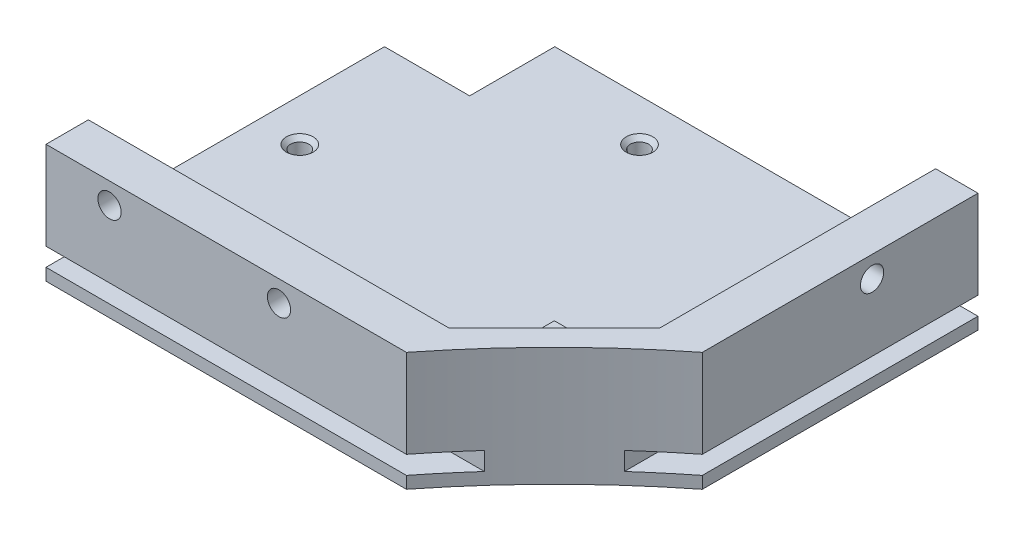
ISO-10303-21;
HEADER;
FILE_DESCRIPTION(('STEP AP214'),'2;1');
FILE_NAME('part.step','',(''),(''),'','','');
FILE_SCHEMA(('AUTOMOTIVE_DESIGN { 1 0 10303 214 1 1 1 1 }'));
ENDSEC;
DATA;
#1=APPLICATION_CONTEXT('core data for automotive mechanical design processes');
#2=APPLICATION_PROTOCOL_DEFINITION('international standard','automotive_design',2000,#1);
#3=PRODUCT_CONTEXT('',#1,'mechanical');
#4=PRODUCT('Part','Part','',(#3));
#5=PRODUCT_RELATED_PRODUCT_CATEGORY('part','',(#4));
#6=PRODUCT_DEFINITION_FORMATION('','',#4);
#7=PRODUCT_DEFINITION_CONTEXT('part definition',#1,'design');
#8=PRODUCT_DEFINITION('design','',#6,#7);
#9=PRODUCT_DEFINITION_SHAPE('','',#8);
#10=(LENGTH_UNIT() NAMED_UNIT(*) SI_UNIT(.MILLI.,.METRE.));
#11=(NAMED_UNIT(*) PLANE_ANGLE_UNIT() SI_UNIT($,.RADIAN.));
#12=(NAMED_UNIT(*) SI_UNIT($,.STERADIAN.) SOLID_ANGLE_UNIT());
#13=UNCERTAINTY_MEASURE_WITH_UNIT(LENGTH_MEASURE(1.E-05),#10,'distance_accuracy_value','');
#14=(GEOMETRIC_REPRESENTATION_CONTEXT(3) GLOBAL_UNCERTAINTY_ASSIGNED_CONTEXT((#13)) GLOBAL_UNIT_ASSIGNED_CONTEXT((#10,
#11,#12)) REPRESENTATION_CONTEXT('',''));
#15=CARTESIAN_POINT('',(0.,0.,0.));
#16=DIRECTION('',(0.,0.,1.));
#17=DIRECTION('',(1.,0.,0.));
#18=AXIS2_PLACEMENT_3D('',#15,#16,#17);
#19=CARTESIAN_POINT('',(160.08,28.,-429.92));
#20=DIRECTION('',(1.,0.,0.));
#21=DIRECTION('',(0.,0.,-1.));
#22=AXIS2_PLACEMENT_3D('',#19,#20,#21);
#23=PLANE('',#22);
#24=DIRECTION('',(0.,0.,1.));
#25=VECTOR('',#24,1.);
#26=CARTESIAN_POINT('',(160.08,17.,-489.92));
#27=LINE('',#26,#25);
#28=CARTESIAN_POINT('',(160.08,17.,-489.92));
#29=VERTEX_POINT('',#28);
#30=CARTESIAN_POINT('',(160.08,17.,-465.));
#31=VERTEX_POINT('',#30);
#32=EDGE_CURVE('E288',#29,#31,#27,.T.);
#33=ORIENTED_EDGE('',*,*,#32,.F.);
#34=DIRECTION('',(0.,-1.,0.));
#35=VECTOR('',#34,1.);
#36=CARTESIAN_POINT('',(160.08,28.,-489.92));
#37=LINE('',#36,#35);
#38=CARTESIAN_POINT('',(160.08,8.,-489.92));
#39=VERTEX_POINT('',#38);
#40=EDGE_CURVE('E298',#29,#39,#37,.T.);
#41=ORIENTED_EDGE('',*,*,#40,.T.);
#42=DIRECTION('',(0.,0.,-1.));
#43=VECTOR('',#42,1.);
#44=CARTESIAN_POINT('',(160.08,8.,-429.92));
#45=LINE('',#44,#43);
#46=CARTESIAN_POINT('',(160.08,8.,-475.));
#47=VERTEX_POINT('',#46);
#48=EDGE_CURVE('E305',#47,#39,#45,.T.);
#49=ORIENTED_EDGE('',*,*,#48,.F.);
#50=DIRECTION('',(0.,-0.668964731622449,-0.743294146247167));
#51=VECTOR('',#50,1.);
#52=CARTESIAN_POINT('',(160.08,17.,-465.));
#53=LINE('',#52,#51);
#54=EDGE_CURVE('E345',#31,#47,#53,.T.);
#55=ORIENTED_EDGE('',*,*,#54,.F.);
#56=EDGE_LOOP('',(#33,#41,#49,#55));
#57=FACE_BOUND('',#56,.T.);
#58=ADVANCED_FACE('F48',(#57),#23,.F.);
#59=CARTESIAN_POINT('',(0.,0.,-489.92));
#60=DIRECTION('',(0.,0.,1.));
#61=DIRECTION('',(1.,0.,0.));
#62=AXIS2_PLACEMENT_3D('',#59,#60,#61);
#63=PLANE('',#62);
#64=DIRECTION('',(-1.,0.,0.));
#65=VECTOR('',#64,1.);
#66=CARTESIAN_POINT('',(185.,17.,-489.92));
#67=LINE('',#66,#65);
#68=CARTESIAN_POINT('',(185.,17.,-489.92));
#69=VERTEX_POINT('',#68);
#70=EDGE_CURVE('E285',#69,#29,#67,.T.);
#71=ORIENTED_EDGE('',*,*,#70,.F.);
#72=DIRECTION('',(0.743294146247166,0.66896473162245,0.));
#73=VECTOR('',#72,1.);
#74=CARTESIAN_POINT('',(185.,17.,-489.92));
#75=LINE('',#74,#73);
#76=CARTESIAN_POINT('',(175.,8.,-489.92));
#77=VERTEX_POINT('',#76);
#78=EDGE_CURVE('E353',#77,#69,#75,.T.);
#79=ORIENTED_EDGE('',*,*,#78,.F.);
#80=DIRECTION('',(1.,0.,0.));
#81=VECTOR('',#80,1.);
#82=CARTESIAN_POINT('',(160.08,8.,-489.92));
#83=LINE('',#82,#81);
#84=EDGE_CURVE('E301',#39,#77,#83,.T.);
#85=ORIENTED_EDGE('',*,*,#84,.F.);
#86=ORIENTED_EDGE('',*,*,#40,.F.);
#87=EDGE_LOOP('',(#71,#79,#85,#86));
#88=FACE_BOUND('',#87,.T.);
#89=ADVANCED_FACE('F542',(#88),#63,.F.);
#90=CARTESIAN_POINT('',(0.,8.,0.));
#91=DIRECTION('',(0.,-1.,0.));
#92=DIRECTION('',(0.,0.,-1.));
#93=AXIS2_PLACEMENT_3D('',#90,#91,#92);
#94=PLANE('',#93);
#95=CARTESIAN_POINT('',(125.1,8.,-545.));
#96=DIRECTION('',(0.,-1.,0.));
#97=DIRECTION('',(0.,0.,-1.));
#98=AXIS2_PLACEMENT_3D('',#95,#96,#97);
#99=CIRCLE('',#98,3.14999999999999);
#100=CARTESIAN_POINT('',(125.1,8.,-548.15));
#101=VERTEX_POINT('',#100);
#102=EDGE_CURVE('E58',#101,#101,#99,.T.);
#103=ORIENTED_EDGE('',*,*,#102,.T.);
#104=EDGE_LOOP('',(#103));
#105=FACE_BOUND('',#104,.T.);
#106=CARTESIAN_POINT('',(85.,8.,-504.9));
#107=DIRECTION('',(0.,-1.,0.));
#108=DIRECTION('',(0.,0.,-1.));
#109=AXIS2_PLACEMENT_3D('',#106,#107,#108);
#110=CIRCLE('',#109,3.14999999999999);
#111=CARTESIAN_POINT('',(85.,8.,-508.05));
#112=VERTEX_POINT('',#111);
#113=EDGE_CURVE('E443',#112,#112,#110,.T.);
#114=ORIENTED_EDGE('',*,*,#113,.T.);
#115=EDGE_LOOP('',(#114));
#116=FACE_BOUND('',#115,.T.);
#117=DIRECTION('',(-1.,0.,0.));
#118=VECTOR('',#117,1.);
#119=CARTESIAN_POINT('',(0.,8.,-555.));
#120=LINE('',#119,#118);
#121=CARTESIAN_POINT('',(175.,8.,-555.));
#122=VERTEX_POINT('',#121);
#123=CARTESIAN_POINT('',(95.1,8.,-555.));
#124=VERTEX_POINT('',#123);
#125=EDGE_CURVE('E254',#122,#124,#120,.T.);
#126=ORIENTED_EDGE('',*,*,#125,.T.);
#127=DIRECTION('',(0.,0.,-1.));
#128=VECTOR('',#127,1.);
#129=CARTESIAN_POINT('',(95.1,8.,-555.));
#130=LINE('',#129,#128);
#131=CARTESIAN_POINT('',(95.1,8.,-534.9));
#132=VERTEX_POINT('',#131);
#133=EDGE_CURVE('E216',#132,#124,#130,.T.);
#134=ORIENTED_EDGE('',*,*,#133,.F.);
#135=DIRECTION('',(1.,0.,0.));
#136=VECTOR('',#135,1.);
#137=CARTESIAN_POINT('',(95.1,8.,-534.9));
#138=LINE('',#137,#136);
#139=CARTESIAN_POINT('',(75.,8.,-534.9));
#140=VERTEX_POINT('',#139);
#141=EDGE_CURVE('E201',#140,#132,#138,.T.);
#142=ORIENTED_EDGE('',*,*,#141,.F.);
#143=DIRECTION('',(0.,0.,1.));
#144=VECTOR('',#143,1.);
#145=CARTESIAN_POINT('',(75.,8.,0.));
#146=LINE('',#145,#144);
#147=CARTESIAN_POINT('',(75.,8.00000000000002,-475.));
#148=VERTEX_POINT('',#147);
#149=EDGE_CURVE('E214',#140,#148,#146,.T.);
#150=ORIENTED_EDGE('',*,*,#149,.T.);
#151=DIRECTION('',(-1.,0.,0.));
#152=VECTOR('',#151,1.);
#153=CARTESIAN_POINT('',(160.08,8.,-475.));
#154=LINE('',#153,#152);
#155=EDGE_CURVE('E350',#47,#148,#154,.T.);
#156=ORIENTED_EDGE('',*,*,#155,.F.);
#157=ORIENTED_EDGE('',*,*,#48,.T.);
#158=ORIENTED_EDGE('',*,*,#84,.T.);
#159=DIRECTION('',(0.,0.,-1.));
#160=VECTOR('',#159,1.);
#161=CARTESIAN_POINT('',(175.,8.,-489.92));
#162=LINE('',#161,#160);
#163=EDGE_CURVE('E372',#77,#122,#162,.T.);
#164=ORIENTED_EDGE('',*,*,#163,.T.);
#165=EDGE_LOOP('',(#126,#134,#142,#150,#156,#157,#158,#164));
#166=FACE_BOUND('',#165,.T.);
#167=ADVANCED_FACE('F212',(#105,#116,#166),#94,.F.);
#168=CARTESIAN_POINT('',(195.,0.,-489.924225024707));
#169=DIRECTION('',(1.,0.,0.));
#170=DIRECTION('',(0.,0.,-1.));
#171=AXIS2_PLACEMENT_3D('',#168,#169,#170);
#172=PLANE('',#171);
#173=DIRECTION('',(0.,1.,0.));
#174=VECTOR('',#173,1.);
#175=CARTESIAN_POINT('',(195.,0.,-555.));
#176=LINE('',#175,#174);
#177=CARTESIAN_POINT('',(195.,7.15,-555.));
#178=VERTEX_POINT('',#177);
#179=CARTESIAN_POINT('',(195.,28.,-555.));
#180=VERTEX_POINT('',#179);
#181=EDGE_CURVE('E237',#178,#180,#176,.T.);
#182=ORIENTED_EDGE('',*,*,#181,.T.);
#183=DIRECTION('',(0.,0.,-1.));
#184=VECTOR('',#183,1.);
#185=CARTESIAN_POINT('',(195.,28.,-489.92));
#186=LINE('',#185,#184);
#187=CARTESIAN_POINT('',(195.,28.,-489.924225024706));
#188=VERTEX_POINT('',#187);
#189=EDGE_CURVE('E373',#188,#180,#186,.T.);
#190=ORIENTED_EDGE('',*,*,#189,.F.);
#191=DIRECTION('',(0.,1.,0.));
#192=VECTOR('',#191,1.);
#193=CARTESIAN_POINT('',(195.,0.,-489.924225024707));
#194=LINE('',#193,#192);
#195=CARTESIAN_POINT('',(195.,7.15,-489.924225024707));
#196=VERTEX_POINT('',#195);
#197=EDGE_CURVE('E405',#188,#196,#194,.F.);
#198=ORIENTED_EDGE('',*,*,#197,.T.);
#199=DIRECTION('',(0.,0.,1.));
#200=VECTOR('',#199,1.);
#201=CARTESIAN_POINT('',(195.,7.15,-489.924225024707));
#202=LINE('',#201,#200);
#203=EDGE_CURVE('E424',#178,#196,#202,.T.);
#204=ORIENTED_EDGE('',*,*,#203,.F.);
#205=EDGE_LOOP('',(#182,#190,#198,#204));
#206=FACE_BOUND('',#205,.T.);
#207=CARTESIAN_POINT('',(195.,23.,-530.));
#208=DIRECTION('',(1.,0.,0.));
#209=DIRECTION('',(0.,0.,-1.));
#210=AXIS2_PLACEMENT_3D('',#207,#208,#209);
#211=CIRCLE('',#210,2.75000000000004);
#212=CARTESIAN_POINT('',(195.,23.,-532.75));
#213=VERTEX_POINT('',#212);
#214=EDGE_CURVE('E277',#213,#213,#211,.T.);
#215=ORIENTED_EDGE('',*,*,#214,.F.);
#216=EDGE_LOOP('',(#215));
#217=FACE_BOUND('',#216,.T.);
#218=ADVANCED_FACE('F557',(#206,#217),#172,.T.);
#219=CARTESIAN_POINT('',(195.,0.,-455.));
#220=DIRECTION('',(0.,0.,1.));
#221=DIRECTION('',(1.,0.,0.));
#222=AXIS2_PLACEMENT_3D('',#219,#220,#221);
#223=PLANE('',#222);
#224=DIRECTION('',(0.,1.,0.));
#225=VECTOR('',#224,1.);
#226=CARTESIAN_POINT('',(75.,0.,-455.));
#227=LINE('',#226,#225);
#228=CARTESIAN_POINT('',(75.,0.,-455.));
#229=VERTEX_POINT('',#228);
#230=CARTESIAN_POINT('',(75.,2.85,-455.));
#231=VERTEX_POINT('',#230);
#232=EDGE_CURVE('E494',#229,#231,#227,.T.);
#233=ORIENTED_EDGE('',*,*,#232,.F.);
#234=DIRECTION('',(1.,0.,0.));
#235=VECTOR('',#234,1.);
#236=CARTESIAN_POINT('',(160.075774975293,0.,-455.));
#237=LINE('',#236,#235);
#238=CARTESIAN_POINT('',(160.075774975293,0.,-455.));
#239=VERTEX_POINT('',#238);
#240=EDGE_CURVE('E377',#229,#239,#237,.T.);
#241=ORIENTED_EDGE('',*,*,#240,.T.);
#242=DIRECTION('',(0.,1.,0.));
#243=VECTOR('',#242,1.);
#244=CARTESIAN_POINT('',(160.075774975293,0.,-455.));
#245=LINE('',#244,#243);
#246=CARTESIAN_POINT('',(160.075774975293,2.85,-455.));
#247=VERTEX_POINT('',#246);
#248=EDGE_CURVE('E400',#239,#247,#245,.T.);
#249=ORIENTED_EDGE('',*,*,#248,.T.);
#250=DIRECTION('',(1.,0.,0.));
#251=VECTOR('',#250,1.);
#252=CARTESIAN_POINT('',(195.,2.85,-455.));
#253=LINE('',#252,#251);
#254=EDGE_CURVE('E413',#231,#247,#253,.T.);
#255=ORIENTED_EDGE('',*,*,#254,.F.);
#256=EDGE_LOOP('',(#233,#241,#249,#255));
#257=FACE_BOUND('',#256,.T.);
#258=ADVANCED_FACE('F468',(#257),#223,.T.);
#259=CARTESIAN_POINT('',(0.,0.,0.));
#260=DIRECTION('',(0.,-1.,0.));
#261=DIRECTION('',(0.,0.,-1.));
#262=AXIS2_PLACEMENT_3D('',#259,#260,#261);
#263=PLANE('',#262);
#264=CARTESIAN_POINT('',(85.,0.,-504.9));
#265=DIRECTION('',(0.,-1.,0.));
#266=DIRECTION('',(0.,0.,-1.));
#267=AXIS2_PLACEMENT_3D('',#264,#265,#266);
#268=CIRCLE('',#267,2.15);
#269=CARTESIAN_POINT('',(85.,0.,-507.05));
#270=VERTEX_POINT('',#269);
#271=EDGE_CURVE('E218',#270,#270,#268,.T.);
#272=ORIENTED_EDGE('',*,*,#271,.F.);
#273=EDGE_LOOP('',(#272));
#274=FACE_BOUND('',#273,.T.);
#275=CARTESIAN_POINT('',(125.1,0.,-545.));
#276=DIRECTION('',(0.,-1.,0.));
#277=DIRECTION('',(0.,0.,-1.));
#278=AXIS2_PLACEMENT_3D('',#275,#276,#277);
#279=CIRCLE('',#278,2.15000000000002);
#280=CARTESIAN_POINT('',(125.1,0.,-547.15));
#281=VERTEX_POINT('',#280);
#282=EDGE_CURVE('E433',#281,#281,#279,.T.);
#283=ORIENTED_EDGE('',*,*,#282,.F.);
#284=EDGE_LOOP('',(#283));
#285=FACE_BOUND('',#284,.T.);
#286=DIRECTION('',(0.,0.,1.));
#287=VECTOR('',#286,1.);
#288=CARTESIAN_POINT('',(95.1,0.,0.));
#289=LINE('',#288,#287);
#290=CARTESIAN_POINT('',(95.1,0.,-555.));
#291=VERTEX_POINT('',#290);
#292=CARTESIAN_POINT('',(95.1,0.,-534.9));
#293=VERTEX_POINT('',#292);
#294=EDGE_CURVE('E472',#291,#293,#289,.T.);
#295=ORIENTED_EDGE('',*,*,#294,.F.);
#296=DIRECTION('',(1.,0.,0.));
#297=VECTOR('',#296,1.);
#298=CARTESIAN_POINT('',(195.,0.,-555.));
#299=LINE('',#298,#297);
#300=CARTESIAN_POINT('',(195.,0.,-555.));
#301=VERTEX_POINT('',#300);
#302=EDGE_CURVE('E229',#291,#301,#299,.T.);
#303=ORIENTED_EDGE('',*,*,#302,.T.);
#304=DIRECTION('',(0.,0.,-1.));
#305=VECTOR('',#304,1.);
#306=CARTESIAN_POINT('',(195.,0.,-455.));
#307=LINE('',#306,#305);
#308=CARTESIAN_POINT('',(195.,0.,-489.924225024707));
#309=VERTEX_POINT('',#308);
#310=EDGE_CURVE('E391',#309,#301,#307,.T.);
#311=ORIENTED_EDGE('',*,*,#310,.F.);
#312=CARTESIAN_POINT('',(325.,0.,-325.));
#313=DIRECTION('',(0.,1.,0.));
#314=DIRECTION('',(0.,0.,1.));
#315=AXIS2_PLACEMENT_3D('',#312,#313,#314);
#316=CIRCLE('',#315,210.);
#317=EDGE_CURVE('E395',#309,#239,#316,.T.);
#318=ORIENTED_EDGE('',*,*,#317,.T.);
#319=ORIENTED_EDGE('',*,*,#240,.F.);
#320=DIRECTION('',(0.,0.,-1.));
#321=VECTOR('',#320,1.);
#322=CARTESIAN_POINT('',(75.,0.,-455.));
#323=LINE('',#322,#321);
#324=CARTESIAN_POINT('',(75.,0.,-534.9));
#325=VERTEX_POINT('',#324);
#326=EDGE_CURVE('E495',#229,#325,#323,.T.);
#327=ORIENTED_EDGE('',*,*,#326,.T.);
#328=DIRECTION('',(-1.,0.,0.));
#329=VECTOR('',#328,1.);
#330=CARTESIAN_POINT('',(0.,0.,-534.9));
#331=LINE('',#330,#329);
#332=EDGE_CURVE('E65',#293,#325,#331,.T.);
#333=ORIENTED_EDGE('',*,*,#332,.F.);
#334=EDGE_LOOP('',(#295,#303,#311,#318,#319,#327,#333));
#335=FACE_BOUND('',#334,.T.);
#336=ADVANCED_FACE('F464',(#274,#285,#335),#263,.T.);
#337=CARTESIAN_POINT('',(325.,0.,-325.));
#338=DIRECTION('',(0.,1.,0.));
#339=DIRECTION('',(0.,0.,1.));
#340=AXIS2_PLACEMENT_3D('',#337,#338,#339);
#341=CYLINDRICAL_SURFACE('',#340,210.);
#342=ORIENTED_EDGE('',*,*,#197,.F.);
#343=CARTESIAN_POINT('',(325.,28.,-325.));
#344=DIRECTION('',(0.,1.,0.));
#345=DIRECTION('',(0.,0.,1.));
#346=AXIS2_PLACEMENT_3D('',#343,#344,#345);
#347=CIRCLE('',#346,210.);
#348=CARTESIAN_POINT('',(160.075774975294,28.,-455.));
#349=VERTEX_POINT('',#348);
#350=EDGE_CURVE('E292',#188,#349,#347,.T.);
#351=ORIENTED_EDGE('',*,*,#350,.T.);
#352=CARTESIAN_POINT('',(160.075774975293,7.15,-455.));
#353=VERTEX_POINT('',#352);
#354=EDGE_CURVE('E399',#353,#349,#245,.T.);
#355=ORIENTED_EDGE('',*,*,#354,.F.);
#356=CARTESIAN_POINT('',(325.,7.15000000000001,-325.));
#357=DIRECTION('',(0.,1.,0.));
#358=DIRECTION('',(0.,0.,1.));
#359=AXIS2_PLACEMENT_3D('',#356,#357,#358);
#360=CIRCLE('',#359,210.);
#361=CARTESIAN_POINT('',(168.475241575015,7.15,-465.));
#362=VERTEX_POINT('',#361);
#363=EDGE_CURVE('E330',#353,#362,#360,.F.);
#364=ORIENTED_EDGE('',*,*,#363,.T.);
#365=DIRECTION('',(0.,1.,0.));
#366=VECTOR('',#365,1.);
#367=CARTESIAN_POINT('',(168.475241575015,0.,-465.));
#368=LINE('',#367,#366);
#369=CARTESIAN_POINT('',(168.475241575015,2.85,-465.));
#370=VERTEX_POINT('',#369);
#371=EDGE_CURVE('E416',#362,#370,#368,.F.);
#372=ORIENTED_EDGE('',*,*,#371,.T.);
#373=CARTESIAN_POINT('',(325.,2.85,-325.));
#374=DIRECTION('',(0.,-1.,0.));
#375=DIRECTION('',(0.,0.,-1.));
#376=AXIS2_PLACEMENT_3D('',#373,#374,#375);
#377=CIRCLE('',#376,210.);
#378=EDGE_CURVE('E337',#370,#247,#377,.F.);
#379=ORIENTED_EDGE('',*,*,#378,.T.);
#380=ORIENTED_EDGE('',*,*,#248,.F.);
#381=ORIENTED_EDGE('',*,*,#317,.F.);
#382=CARTESIAN_POINT('',(195.,2.85,-489.924225024707));
#383=VERTEX_POINT('',#382);
#384=EDGE_CURVE('E404',#383,#309,#194,.F.);
#385=ORIENTED_EDGE('',*,*,#384,.F.);
#386=CARTESIAN_POINT('',(325.,2.84999999999998,-325.));
#387=DIRECTION('',(0.,-1.,0.));
#388=DIRECTION('',(1.,0.,0.));
#389=AXIS2_PLACEMENT_3D('',#386,#387,#388);
#390=CIRCLE('',#389,210.);
#391=CARTESIAN_POINT('',(185.,2.85,-481.524758424985));
#392=VERTEX_POINT('',#391);
#393=EDGE_CURVE('E314',#383,#392,#390,.F.);
#394=ORIENTED_EDGE('',*,*,#393,.T.);
#395=DIRECTION('',(0.,1.,0.));
#396=VECTOR('',#395,1.);
#397=CARTESIAN_POINT('',(185.,0.,-481.524758424985));
#398=LINE('',#397,#396);
#399=CARTESIAN_POINT('',(185.,7.15,-481.524758424985));
#400=VERTEX_POINT('',#399);
#401=EDGE_CURVE('E427',#392,#400,#398,.T.);
#402=ORIENTED_EDGE('',*,*,#401,.T.);
#403=CARTESIAN_POINT('',(325.,7.15,-325.));
#404=DIRECTION('',(0.,1.,0.));
#405=DIRECTION('',(0.,0.,1.));
#406=AXIS2_PLACEMENT_3D('',#403,#404,#405);
#407=CIRCLE('',#406,210.);
#408=EDGE_CURVE('E321',#400,#196,#407,.F.);
#409=ORIENTED_EDGE('',*,*,#408,.T.);
#410=EDGE_LOOP('',(#342,#351,#355,#364,#372,#379,#380,#381,#385,#394,#402,#409));
#411=FACE_BOUND('',#410,.T.);
#412=ADVANCED_FACE('F467',(#411),#341,.F.);
#413=CARTESIAN_POINT('',(75.,7.15,-455.));
#414=VERTEX_POINT('',#413);
#415=CARTESIAN_POINT('',(75.,28.,-455.));
#416=VERTEX_POINT('',#415);
#417=EDGE_CURVE('E497',#414,#416,#227,.T.);
#418=ORIENTED_EDGE('',*,*,#417,.F.);
#419=DIRECTION('',(-1.,0.,0.));
#420=VECTOR('',#419,1.);
#421=CARTESIAN_POINT('',(195.,7.15,-455.));
#422=LINE('',#421,#420);
#423=EDGE_CURVE('E409',#353,#414,#422,.T.);
#424=ORIENTED_EDGE('',*,*,#423,.F.);
#425=ORIENTED_EDGE('',*,*,#354,.T.);
#426=DIRECTION('',(-1.,0.,0.));
#427=VECTOR('',#426,1.);
#428=CARTESIAN_POINT('',(160.08,28.,-455.));
#429=LINE('',#428,#427);
#430=EDGE_CURVE('E349',#349,#416,#429,.T.);
#431=ORIENTED_EDGE('',*,*,#430,.T.);
#432=EDGE_LOOP('',(#418,#424,#425,#431));
#433=FACE_BOUND('',#432,.T.);
#434=CARTESIAN_POINT('',(130.,23.,-455.));
#435=DIRECTION('',(0.,0.,1.));
#436=DIRECTION('',(1.,0.,0.));
#437=AXIS2_PLACEMENT_3D('',#434,#435,#436);
#438=CIRCLE('',#437,2.75000000000001);
#439=CARTESIAN_POINT('',(132.75,23.,-455.));
#440=VERTEX_POINT('',#439);
#441=EDGE_CURVE('E269',#440,#440,#438,.T.);
#442=ORIENTED_EDGE('',*,*,#441,.F.);
#443=EDGE_LOOP('',(#442));
#444=FACE_BOUND('',#443,.T.);
#445=CARTESIAN_POINT('',(90.,23.,-455.));
#446=DIRECTION('',(0.,0.,1.));
#447=DIRECTION('',(1.,0.,0.));
#448=AXIS2_PLACEMENT_3D('',#445,#446,#447);
#449=CIRCLE('',#448,2.75000000000001);
#450=CARTESIAN_POINT('',(92.75,23.,-455.));
#451=VERTEX_POINT('',#450);
#452=EDGE_CURVE('E262',#451,#451,#449,.T.);
#453=ORIENTED_EDGE('',*,*,#452,.F.);
#454=EDGE_LOOP('',(#453));
#455=FACE_BOUND('',#454,.T.);
#456=ADVANCED_FACE('F617',(#433,#444,#455),#223,.T.);
#457=CARTESIAN_POINT('',(195.,2.85,-555.));
#458=VERTEX_POINT('',#457);
#459=EDGE_CURVE('E238',#301,#458,#176,.T.);
#460=ORIENTED_EDGE('',*,*,#459,.T.);
#461=DIRECTION('',(0.,0.,-1.));
#462=VECTOR('',#461,1.);
#463=CARTESIAN_POINT('',(195.,2.85,-489.924225024707));
#464=LINE('',#463,#462);
#465=EDGE_CURVE('E420',#383,#458,#464,.T.);
#466=ORIENTED_EDGE('',*,*,#465,.F.);
#467=ORIENTED_EDGE('',*,*,#384,.T.);
#468=ORIENTED_EDGE('',*,*,#310,.T.);
#469=EDGE_LOOP('',(#460,#466,#467,#468));
#470=FACE_BOUND('',#469,.T.);
#471=ADVANCED_FACE('F485',(#470),#172,.T.);
#472=CARTESIAN_POINT('',(195.,28.,-489.92));
#473=DIRECTION('',(0.,1.,0.));
#474=DIRECTION('',(0.,0.,1.));
#475=AXIS2_PLACEMENT_3D('',#472,#473,#474);
#476=PLANE('',#475);
#477=DIRECTION('',(0.,0.,-1.));
#478=VECTOR('',#477,1.);
#479=CARTESIAN_POINT('',(75.,28.,-455.));
#480=LINE('',#479,#478);
#481=CARTESIAN_POINT('',(75.,28.,-465.));
#482=VERTEX_POINT('',#481);
#483=EDGE_CURVE('E478',#416,#482,#480,.T.);
#484=ORIENTED_EDGE('',*,*,#483,.F.);
#485=ORIENTED_EDGE('',*,*,#430,.F.);
#486=ORIENTED_EDGE('',*,*,#350,.F.);
#487=ORIENTED_EDGE('',*,*,#189,.T.);
#488=DIRECTION('',(1.,0.,0.));
#489=VECTOR('',#488,1.);
#490=CARTESIAN_POINT('',(195.,28.,-555.));
#491=LINE('',#490,#489);
#492=CARTESIAN_POINT('',(185.,28.,-555.));
#493=VERTEX_POINT('',#492);
#494=EDGE_CURVE('E225',#493,#180,#491,.T.);
#495=ORIENTED_EDGE('',*,*,#494,.F.);
#496=DIRECTION('',(0.,0.,-1.));
#497=VECTOR('',#496,1.);
#498=CARTESIAN_POINT('',(185.,28.,-489.92));
#499=LINE('',#498,#497);
#500=CARTESIAN_POINT('',(185.,28.,-489.92));
#501=VERTEX_POINT('',#500);
#502=EDGE_CURVE('E378',#501,#493,#499,.T.);
#503=ORIENTED_EDGE('',*,*,#502,.F.);
#504=DIRECTION('',(0.707106781186547,0.,-0.707106781186548));
#505=VECTOR('',#504,1.);
#506=CARTESIAN_POINT('',(160.08,28.,-465.));
#507=LINE('',#506,#505);
#508=CARTESIAN_POINT('',(160.08,28.,-465.));
#509=VERTEX_POINT('',#508);
#510=EDGE_CURVE('E281',#509,#501,#507,.T.);
#511=ORIENTED_EDGE('',*,*,#510,.F.);
#512=DIRECTION('',(-1.,0.,0.));
#513=VECTOR('',#512,1.);
#514=CARTESIAN_POINT('',(160.08,28.,-465.));
#515=LINE('',#514,#513);
#516=EDGE_CURVE('E358',#509,#482,#515,.T.);
#517=ORIENTED_EDGE('',*,*,#516,.T.);
#518=EDGE_LOOP('',(#484,#485,#486,#487,#495,#503,#511,#517));
#519=FACE_BOUND('',#518,.T.);
#520=ADVANCED_FACE('F532',(#519),#476,.T.);
#521=CARTESIAN_POINT('',(185.,28.,-489.92));
#522=DIRECTION('',(-1.,0.,0.));
#523=DIRECTION('',(0.,0.,1.));
#524=AXIS2_PLACEMENT_3D('',#521,#522,#523);
#525=PLANE('',#524);
#526=DIRECTION('',(0.,1.,0.));
#527=VECTOR('',#526,1.);
#528=CARTESIAN_POINT('',(185.,28.,-555.));
#529=LINE('',#528,#527);
#530=CARTESIAN_POINT('',(185.,17.,-555.));
#531=VERTEX_POINT('',#530);
#532=EDGE_CURVE('E251',#531,#493,#529,.T.);
#533=ORIENTED_EDGE('',*,*,#532,.F.);
#534=DIRECTION('',(0.,0.,-1.));
#535=VECTOR('',#534,1.);
#536=CARTESIAN_POINT('',(185.,17.,-489.92));
#537=LINE('',#536,#535);
#538=EDGE_CURVE('E382',#69,#531,#537,.T.);
#539=ORIENTED_EDGE('',*,*,#538,.F.);
#540=DIRECTION('',(0.,1.,0.));
#541=VECTOR('',#540,1.);
#542=CARTESIAN_POINT('',(185.,28.,-489.92));
#543=LINE('',#542,#541);
#544=EDGE_CURVE('E368',#69,#501,#543,.T.);
#545=ORIENTED_EDGE('',*,*,#544,.T.);
#546=ORIENTED_EDGE('',*,*,#502,.T.);
#547=EDGE_LOOP('',(#533,#539,#545,#546));
#548=FACE_BOUND('',#547,.T.);
#549=CARTESIAN_POINT('',(185.,23.,-530.));
#550=DIRECTION('',(-1.,0.,0.));
#551=DIRECTION('',(0.,0.,1.));
#552=AXIS2_PLACEMENT_3D('',#549,#550,#551);
#553=CIRCLE('',#552,2.75000000000004);
#554=CARTESIAN_POINT('',(185.,23.,-527.25));
#555=VERTEX_POINT('',#554);
#556=EDGE_CURVE('E273',#555,#555,#553,.T.);
#557=ORIENTED_EDGE('',*,*,#556,.F.);
#558=EDGE_LOOP('',(#557));
#559=FACE_BOUND('',#558,.T.);
#560=ADVANCED_FACE('F537',(#548,#559),#525,.T.);
#561=CARTESIAN_POINT('',(185.,17.,-489.92));
#562=DIRECTION('',(-0.66896473162245,0.743294146247166,0.));
#563=DIRECTION('',(-0.743294146247166,-0.668964731622451,0.));
#564=AXIS2_PLACEMENT_3D('',#561,#562,#563);
#565=PLANE('',#564);
#566=DIRECTION('',(0.743294146247166,0.668964731622451,0.));
#567=VECTOR('',#566,1.);
#568=CARTESIAN_POINT('',(185.,17.,-555.));
#569=LINE('',#568,#567);
#570=EDGE_CURVE('E248',#122,#531,#569,.T.);
#571=ORIENTED_EDGE('',*,*,#570,.F.);
#572=ORIENTED_EDGE('',*,*,#163,.F.);
#573=ORIENTED_EDGE('',*,*,#78,.T.);
#574=ORIENTED_EDGE('',*,*,#538,.T.);
#575=EDGE_LOOP('',(#571,#572,#573,#574));
#576=FACE_BOUND('',#575,.T.);
#577=ADVANCED_FACE('F552',(#576),#565,.T.);
#578=CARTESIAN_POINT('',(160.08,17.,-465.));
#579=DIRECTION('',(0.,0.743294146247167,-0.66896473162245));
#580=DIRECTION('',(0.,0.668964731622449,0.743294146247167));
#581=AXIS2_PLACEMENT_3D('',#578,#579,#580);
#582=PLANE('',#581);
#583=DIRECTION('',(0.,-0.668964731622449,-0.743294146247167));
#584=VECTOR('',#583,1.);
#585=CARTESIAN_POINT('',(75.,17.,-465.));
#586=LINE('',#585,#584);
#587=CARTESIAN_POINT('',(75.,17.,-465.));
#588=VERTEX_POINT('',#587);
#589=EDGE_CURVE('E222',#588,#148,#586,.T.);
#590=ORIENTED_EDGE('',*,*,#589,.F.);
#591=DIRECTION('',(-1.,0.,0.));
#592=VECTOR('',#591,1.);
#593=CARTESIAN_POINT('',(160.08,17.,-465.));
#594=LINE('',#593,#592);
#595=EDGE_CURVE('E354',#31,#588,#594,.T.);
#596=ORIENTED_EDGE('',*,*,#595,.F.);
#597=ORIENTED_EDGE('',*,*,#54,.T.);
#598=ORIENTED_EDGE('',*,*,#155,.T.);
#599=EDGE_LOOP('',(#590,#596,#597,#598));
#600=FACE_BOUND('',#599,.T.);
#601=ADVANCED_FACE('F523',(#600),#582,.T.);
#602=CARTESIAN_POINT('',(160.08,28.,-465.));
#603=DIRECTION('',(0.,0.,-1.));
#604=DIRECTION('',(-1.,0.,0.));
#605=AXIS2_PLACEMENT_3D('',#602,#603,#604);
#606=PLANE('',#605);
#607=DIRECTION('',(0.,-1.,0.));
#608=VECTOR('',#607,1.);
#609=CARTESIAN_POINT('',(75.,28.,-465.));
#610=LINE('',#609,#608);
#611=EDGE_CURVE('E231',#482,#588,#610,.T.);
#612=ORIENTED_EDGE('',*,*,#611,.F.);
#613=ORIENTED_EDGE('',*,*,#516,.F.);
#614=DIRECTION('',(0.,-1.,0.));
#615=VECTOR('',#614,1.);
#616=CARTESIAN_POINT('',(160.08,28.,-465.));
#617=LINE('',#616,#615);
#618=EDGE_CURVE('E341',#509,#31,#617,.T.);
#619=ORIENTED_EDGE('',*,*,#618,.T.);
#620=ORIENTED_EDGE('',*,*,#595,.T.);
#621=EDGE_LOOP('',(#612,#613,#619,#620));
#622=FACE_BOUND('',#621,.T.);
#623=CARTESIAN_POINT('',(130.,23.,-465.));
#624=DIRECTION('',(0.,0.,-1.));
#625=DIRECTION('',(-1.,0.,0.));
#626=AXIS2_PLACEMENT_3D('',#623,#624,#625);
#627=CIRCLE('',#626,2.75000000000001);
#628=CARTESIAN_POINT('',(127.25,23.,-465.));
#629=VERTEX_POINT('',#628);
#630=EDGE_CURVE('E258',#629,#629,#627,.T.);
#631=ORIENTED_EDGE('',*,*,#630,.F.);
#632=EDGE_LOOP('',(#631));
#633=FACE_BOUND('',#632,.T.);
#634=CARTESIAN_POINT('',(90.,23.,-465.));
#635=DIRECTION('',(0.,0.,-1.));
#636=DIRECTION('',(-1.,0.,0.));
#637=AXIS2_PLACEMENT_3D('',#634,#635,#636);
#638=CIRCLE('',#637,2.75000000000001);
#639=CARTESIAN_POINT('',(87.25,23.,-465.));
#640=VERTEX_POINT('',#639);
#641=EDGE_CURVE('E257',#640,#640,#638,.T.);
#642=ORIENTED_EDGE('',*,*,#641,.F.);
#643=EDGE_LOOP('',(#642));
#644=FACE_BOUND('',#643,.T.);
#645=ADVANCED_FACE('F524',(#622,#633,#644),#606,.T.);
#646=CARTESIAN_POINT('',(195.,7.15,-465.));
#647=DIRECTION('',(0.,0.,-1.));
#648=DIRECTION('',(-1.,0.,0.));
#649=AXIS2_PLACEMENT_3D('',#646,#647,#648);
#650=PLANE('',#649);
#651=DIRECTION('',(-1.,0.,0.));
#652=VECTOR('',#651,1.);
#653=CARTESIAN_POINT('',(195.,7.15,-465.));
#654=LINE('',#653,#652);
#655=CARTESIAN_POINT('',(75.,7.15,-465.));
#656=VERTEX_POINT('',#655);
#657=EDGE_CURVE('E325',#362,#656,#654,.T.);
#658=ORIENTED_EDGE('',*,*,#657,.T.);
#659=DIRECTION('',(0.,-1.,0.));
#660=VECTOR('',#659,1.);
#661=CARTESIAN_POINT('',(75.,7.15,-465.));
#662=LINE('',#661,#660);
#663=CARTESIAN_POINT('',(75.,2.85,-465.));
#664=VERTEX_POINT('',#663);
#665=EDGE_CURVE('E509',#656,#664,#662,.T.);
#666=ORIENTED_EDGE('',*,*,#665,.T.);
#667=DIRECTION('',(-1.,0.,0.));
#668=VECTOR('',#667,1.);
#669=CARTESIAN_POINT('',(195.,2.85,-465.));
#670=LINE('',#669,#668);
#671=EDGE_CURVE('E326',#370,#664,#670,.T.);
#672=ORIENTED_EDGE('',*,*,#671,.F.);
#673=ORIENTED_EDGE('',*,*,#371,.F.);
#674=EDGE_LOOP('',(#658,#666,#672,#673));
#675=FACE_BOUND('',#674,.T.);
#676=ADVANCED_FACE('F602',(#675),#650,.F.);
#677=CARTESIAN_POINT('',(195.,2.85,-465.));
#678=DIRECTION('',(0.,-1.,0.));
#679=DIRECTION('',(0.,0.,-1.));
#680=AXIS2_PLACEMENT_3D('',#677,#678,#679);
#681=PLANE('',#680);
#682=ORIENTED_EDGE('',*,*,#671,.T.);
#683=DIRECTION('',(0.,0.,1.));
#684=VECTOR('',#683,1.);
#685=CARTESIAN_POINT('',(75.,2.85,-465.));
#686=LINE('',#685,#684);
#687=EDGE_CURVE('E513',#664,#231,#686,.T.);
#688=ORIENTED_EDGE('',*,*,#687,.T.);
#689=ORIENTED_EDGE('',*,*,#254,.T.);
#690=ORIENTED_EDGE('',*,*,#378,.F.);
#691=EDGE_LOOP('',(#682,#688,#689,#690));
#692=FACE_BOUND('',#691,.T.);
#693=ADVANCED_FACE('F595',(#692),#681,.F.);
#694=CARTESIAN_POINT('',(195.,7.15,-455.));
#695=DIRECTION('',(0.,1.,0.));
#696=DIRECTION('',(0.,0.,1.));
#697=AXIS2_PLACEMENT_3D('',#694,#695,#696);
#698=PLANE('',#697);
#699=ORIENTED_EDGE('',*,*,#423,.T.);
#700=DIRECTION('',(0.,0.,-1.));
#701=VECTOR('',#700,1.);
#702=CARTESIAN_POINT('',(75.,7.15,-455.));
#703=LINE('',#702,#701);
#704=EDGE_CURVE('E505',#414,#656,#703,.T.);
#705=ORIENTED_EDGE('',*,*,#704,.T.);
#706=ORIENTED_EDGE('',*,*,#657,.F.);
#707=ORIENTED_EDGE('',*,*,#363,.F.);
#708=EDGE_LOOP('',(#699,#705,#706,#707));
#709=FACE_BOUND('',#708,.T.);
#710=ADVANCED_FACE('F590',(#709),#698,.F.);
#711=CARTESIAN_POINT('',(185.,7.15,-455.));
#712=DIRECTION('',(-1.,0.,0.));
#713=DIRECTION('',(0.,0.,1.));
#714=AXIS2_PLACEMENT_3D('',#711,#712,#713);
#715=PLANE('',#714);
#716=DIRECTION('',(0.,0.,-1.));
#717=VECTOR('',#716,1.);
#718=CARTESIAN_POINT('',(185.,2.85,-455.));
#719=LINE('',#718,#717);
#720=CARTESIAN_POINT('',(185.,2.85,-555.));
#721=VERTEX_POINT('',#720);
#722=EDGE_CURVE('E309',#392,#721,#719,.T.);
#723=ORIENTED_EDGE('',*,*,#722,.T.);
#724=DIRECTION('',(0.,1.,0.));
#725=VECTOR('',#724,1.);
#726=CARTESIAN_POINT('',(185.,7.15,-555.));
#727=LINE('',#726,#725);
#728=CARTESIAN_POINT('',(185.,7.15,-555.));
#729=VERTEX_POINT('',#728);
#730=EDGE_CURVE('E73',#721,#729,#727,.T.);
#731=ORIENTED_EDGE('',*,*,#730,.T.);
#732=DIRECTION('',(0.,0.,-1.));
#733=VECTOR('',#732,1.);
#734=CARTESIAN_POINT('',(185.,7.15,-455.));
#735=LINE('',#734,#733);
#736=EDGE_CURVE('E310',#400,#729,#735,.T.);
#737=ORIENTED_EDGE('',*,*,#736,.F.);
#738=ORIENTED_EDGE('',*,*,#401,.F.);
#739=EDGE_LOOP('',(#723,#731,#737,#738));
#740=FACE_BOUND('',#739,.T.);
#741=ADVANCED_FACE('F567',(#740),#715,.F.);
#742=CARTESIAN_POINT('',(195.,7.15,-455.));
#743=DIRECTION('',(0.,1.,0.));
#744=DIRECTION('',(0.,0.,1.));
#745=AXIS2_PLACEMENT_3D('',#742,#743,#744);
#746=PLANE('',#745);
#747=ORIENTED_EDGE('',*,*,#736,.T.);
#748=DIRECTION('',(1.,0.,0.));
#749=VECTOR('',#748,1.);
#750=CARTESIAN_POINT('',(195.,7.15,-555.));
#751=LINE('',#750,#749);
#752=EDGE_CURVE('E244',#729,#178,#751,.T.);
#753=ORIENTED_EDGE('',*,*,#752,.T.);
#754=ORIENTED_EDGE('',*,*,#203,.T.);
#755=ORIENTED_EDGE('',*,*,#408,.F.);
#756=EDGE_LOOP('',(#747,#753,#754,#755));
#757=FACE_BOUND('',#756,.T.);
#758=ADVANCED_FACE('F565',(#757),#746,.F.);
#759=CARTESIAN_POINT('',(185.,2.85,-455.));
#760=DIRECTION('',(0.,-1.,0.));
#761=DIRECTION('',(1.,0.,0.));
#762=AXIS2_PLACEMENT_3D('',#759,#760,#761);
#763=PLANE('',#762);
#764=ORIENTED_EDGE('',*,*,#465,.T.);
#765=DIRECTION('',(-1.,0.,0.));
#766=VECTOR('',#765,1.);
#767=CARTESIAN_POINT('',(185.,2.85,-555.));
#768=LINE('',#767,#766);
#769=EDGE_CURVE('E208',#458,#721,#768,.T.);
#770=ORIENTED_EDGE('',*,*,#769,.T.);
#771=ORIENTED_EDGE('',*,*,#722,.F.);
#772=ORIENTED_EDGE('',*,*,#393,.F.);
#773=EDGE_LOOP('',(#764,#770,#771,#772));
#774=FACE_BOUND('',#773,.T.);
#775=ADVANCED_FACE('F570',(#774),#763,.F.);
#776=CARTESIAN_POINT('',(160.08,17.,-465.));
#777=DIRECTION('',(0.707106781186548,0.,0.707106781186547));
#778=DIRECTION('',(0.707106781186547,0.,-0.707106781186548));
#779=AXIS2_PLACEMENT_3D('',#776,#777,#778);
#780=PLANE('',#779);
#781=ORIENTED_EDGE('',*,*,#510,.T.);
#782=ORIENTED_EDGE('',*,*,#544,.F.);
#783=DIRECTION('',(0.707106781186547,0.,-0.707106781186548));
#784=VECTOR('',#783,1.);
#785=CARTESIAN_POINT('',(160.08,17.,-465.));
#786=LINE('',#785,#784);
#787=EDGE_CURVE('E282',#31,#69,#786,.T.);
#788=ORIENTED_EDGE('',*,*,#787,.F.);
#789=ORIENTED_EDGE('',*,*,#618,.F.);
#790=EDGE_LOOP('',(#781,#782,#788,#789));
#791=FACE_BOUND('',#790,.T.);
#792=ADVANCED_FACE('F528',(#791),#780,.F.);
#793=CARTESIAN_POINT('',(0.,17.,0.));
#794=DIRECTION('',(0.,1.,0.));
#795=DIRECTION('',(0.,0.,1.));
#796=AXIS2_PLACEMENT_3D('',#793,#794,#795);
#797=PLANE('',#796);
#798=ORIENTED_EDGE('',*,*,#787,.T.);
#799=ORIENTED_EDGE('',*,*,#70,.T.);
#800=ORIENTED_EDGE('',*,*,#32,.T.);
#801=EDGE_LOOP('',(#798,#799,#800));
#802=FACE_BOUND('',#801,.T.);
#803=ADVANCED_FACE('F546',(#802),#797,.T.);
#804=CARTESIAN_POINT('',(196.,23.,-530.));
#805=DIRECTION('',(-1.,0.,0.));
#806=DIRECTION('',(0.,0.,1.));
#807=AXIS2_PLACEMENT_3D('',#804,#805,#806);
#808=CYLINDRICAL_SURFACE('',#807,2.75000000000004);
#809=ORIENTED_EDGE('',*,*,#214,.T.);
#810=EDGE_LOOP('',(#809));
#811=FACE_BOUND('',#810,.T.);
#812=ORIENTED_EDGE('',*,*,#556,.T.);
#813=EDGE_LOOP('',(#812));
#814=FACE_BOUND('',#813,.T.);
#815=ADVANCED_FACE('F779',(#811,#814),#808,.F.);
#816=CARTESIAN_POINT('',(90.,23.,-454.));
#817=DIRECTION('',(0.,0.,-1.));
#818=DIRECTION('',(-1.,0.,0.));
#819=AXIS2_PLACEMENT_3D('',#816,#817,#818);
#820=CYLINDRICAL_SURFACE('',#819,2.75000000000001);
#821=ORIENTED_EDGE('',*,*,#452,.T.);
#822=EDGE_LOOP('',(#821));
#823=FACE_BOUND('',#822,.T.);
#824=ORIENTED_EDGE('',*,*,#641,.T.);
#825=EDGE_LOOP('',(#824));
#826=FACE_BOUND('',#825,.T.);
#827=ADVANCED_FACE('F788',(#823,#826),#820,.F.);
#828=CARTESIAN_POINT('',(130.,23.,-454.));
#829=DIRECTION('',(0.,0.,-1.));
#830=DIRECTION('',(-1.,0.,0.));
#831=AXIS2_PLACEMENT_3D('',#828,#829,#830);
#832=CYLINDRICAL_SURFACE('',#831,2.75000000000001);
#833=ORIENTED_EDGE('',*,*,#441,.T.);
#834=EDGE_LOOP('',(#833));
#835=FACE_BOUND('',#834,.T.);
#836=ORIENTED_EDGE('',*,*,#630,.T.);
#837=EDGE_LOOP('',(#836));
#838=FACE_BOUND('',#837,.T.);
#839=ADVANCED_FACE('F798',(#835,#838),#832,.F.);
#840=CARTESIAN_POINT('',(195.,0.,-555.));
#841=DIRECTION('',(0.,0.,1.));
#842=DIRECTION('',(1.,0.,0.));
#843=AXIS2_PLACEMENT_3D('',#840,#841,#842);
#844=PLANE('',#843);
#845=ORIENTED_EDGE('',*,*,#302,.F.);
#846=DIRECTION('',(0.,1.,0.));
#847=VECTOR('',#846,1.);
#848=CARTESIAN_POINT('',(95.1,-2.,-555.));
#849=LINE('',#848,#847);
#850=EDGE_CURVE('E482',#291,#124,#849,.T.);
#851=ORIENTED_EDGE('',*,*,#850,.T.);
#852=ORIENTED_EDGE('',*,*,#125,.F.);
#853=ORIENTED_EDGE('',*,*,#570,.T.);
#854=ORIENTED_EDGE('',*,*,#532,.T.);
#855=ORIENTED_EDGE('',*,*,#494,.T.);
#856=ORIENTED_EDGE('',*,*,#181,.F.);
#857=ORIENTED_EDGE('',*,*,#752,.F.);
#858=ORIENTED_EDGE('',*,*,#730,.F.);
#859=ORIENTED_EDGE('',*,*,#769,.F.);
#860=ORIENTED_EDGE('',*,*,#459,.F.);
#861=EDGE_LOOP('',(#845,#851,#852,#853,#854,#855,#856,#857,#858,#859,#860));
#862=FACE_BOUND('',#861,.T.);
#863=ADVANCED_FACE('F481',(#862),#844,.F.);
#864=CARTESIAN_POINT('',(75.,0.,-455.));
#865=DIRECTION('',(1.,0.,0.));
#866=DIRECTION('',(0.,0.,-1.));
#867=AXIS2_PLACEMENT_3D('',#864,#865,#866);
#868=PLANE('',#867);
#869=ORIENTED_EDGE('',*,*,#149,.F.);
#870=DIRECTION('',(0.,-1.,0.));
#871=VECTOR('',#870,1.);
#872=CARTESIAN_POINT('',(75.,0.,-534.9));
#873=LINE('',#872,#871);
#874=EDGE_CURVE('E198',#140,#325,#873,.T.);
#875=ORIENTED_EDGE('',*,*,#874,.T.);
#876=ORIENTED_EDGE('',*,*,#326,.F.);
#877=ORIENTED_EDGE('',*,*,#232,.T.);
#878=ORIENTED_EDGE('',*,*,#687,.F.);
#879=ORIENTED_EDGE('',*,*,#665,.F.);
#880=ORIENTED_EDGE('',*,*,#704,.F.);
#881=ORIENTED_EDGE('',*,*,#417,.T.);
#882=ORIENTED_EDGE('',*,*,#483,.T.);
#883=ORIENTED_EDGE('',*,*,#611,.T.);
#884=ORIENTED_EDGE('',*,*,#589,.T.);
#885=EDGE_LOOP('',(#869,#875,#876,#877,#878,#879,#880,#881,#882,#883,#884));
#886=FACE_BOUND('',#885,.T.);
#887=ADVANCED_FACE('F220',(#886),#868,.F.);
#888=CARTESIAN_POINT('',(95.1,-2.,-555.));
#889=DIRECTION('',(1.,0.,0.));
#890=DIRECTION('',(0.,0.,-1.));
#891=AXIS2_PLACEMENT_3D('',#888,#889,#890);
#892=PLANE('',#891);
#893=ORIENTED_EDGE('',*,*,#294,.T.);
#894=DIRECTION('',(0.,1.,0.));
#895=VECTOR('',#894,1.);
#896=CARTESIAN_POINT('',(95.1,-2.,-534.9));
#897=LINE('',#896,#895);
#898=EDGE_CURVE('E907',#293,#132,#897,.T.);
#899=ORIENTED_EDGE('',*,*,#898,.T.);
#900=ORIENTED_EDGE('',*,*,#133,.T.);
#901=ORIENTED_EDGE('',*,*,#850,.F.);
#902=EDGE_LOOP('',(#893,#899,#900,#901));
#903=FACE_BOUND('',#902,.T.);
#904=ADVANCED_FACE('F823',(#903),#892,.F.);
#905=CARTESIAN_POINT('',(95.1,-2.,-534.9));
#906=DIRECTION('',(0.,0.,1.));
#907=DIRECTION('',(1.,0.,0.));
#908=AXIS2_PLACEMENT_3D('',#905,#906,#907);
#909=PLANE('',#908);
#910=ORIENTED_EDGE('',*,*,#332,.T.);
#911=ORIENTED_EDGE('',*,*,#874,.F.);
#912=ORIENTED_EDGE('',*,*,#141,.T.);
#913=ORIENTED_EDGE('',*,*,#898,.F.);
#914=EDGE_LOOP('',(#910,#911,#912,#913));
#915=FACE_BOUND('',#914,.T.);
#916=ADVANCED_FACE('F200',(#915),#909,.F.);
#917=CARTESIAN_POINT('',(125.1,-2.,-545.));
#918=DIRECTION('',(0.,1.,0.));
#919=DIRECTION('',(0.,0.,1.));
#920=AXIS2_PLACEMENT_3D('',#917,#918,#919);
#921=CYLINDRICAL_SURFACE('',#920,2.15000000000002);
#922=CARTESIAN_POINT('',(125.1,7.00000000000005,-545.));
#923=DIRECTION('',(0.,-1.,0.));
#924=DIRECTION('',(0.,0.,-1.));
#925=AXIS2_PLACEMENT_3D('',#922,#923,#924);
#926=CIRCLE('',#925,2.15000000000002);
#927=CARTESIAN_POINT('',(125.1,7.00000000000005,-547.15));
#928=VERTEX_POINT('',#927);
#929=EDGE_CURVE('E207',#928,#928,#926,.F.);
#930=ORIENTED_EDGE('',*,*,#929,.T.);
#931=EDGE_LOOP('',(#930));
#932=FACE_BOUND('',#931,.T.);
#933=ORIENTED_EDGE('',*,*,#282,.T.);
#934=EDGE_LOOP('',(#933));
#935=FACE_BOUND('',#934,.T.);
#936=ADVANCED_FACE('F458',(#932,#935),#921,.F.);
#937=CARTESIAN_POINT('',(85.,-2.,-504.9));
#938=DIRECTION('',(0.,1.,0.));
#939=DIRECTION('',(0.,0.,1.));
#940=AXIS2_PLACEMENT_3D('',#937,#938,#939);
#941=CYLINDRICAL_SURFACE('',#940,2.15);
#942=CARTESIAN_POINT('',(85.,7.00000000000004,-504.9));
#943=DIRECTION('',(0.,-1.,0.));
#944=DIRECTION('',(0.,0.,-1.));
#945=AXIS2_PLACEMENT_3D('',#942,#943,#944);
#946=CIRCLE('',#945,2.15);
#947=CARTESIAN_POINT('',(85.,7.00000000000004,-507.05));
#948=VERTEX_POINT('',#947);
#949=EDGE_CURVE('E12',#948,#948,#946,.F.);
#950=ORIENTED_EDGE('',*,*,#949,.T.);
#951=EDGE_LOOP('',(#950));
#952=FACE_BOUND('',#951,.T.);
#953=ORIENTED_EDGE('',*,*,#271,.T.);
#954=EDGE_LOOP('',(#953));
#955=FACE_BOUND('',#954,.T.);
#956=ADVANCED_FACE('F455',(#952,#955),#941,.F.);
#957=CARTESIAN_POINT('',(125.1,7.00000000000005,-545.));
#958=DIRECTION('',(0.,1.,0.));
#959=DIRECTION('',(0.,0.,1.));
#960=AXIS2_PLACEMENT_3D('',#957,#958,#959);
#961=CONICAL_SURFACE('',#960,2.15000000000002,0.785398163397459);
#962=ORIENTED_EDGE('',*,*,#102,.F.);
#963=EDGE_LOOP('',(#962));
#964=FACE_BOUND('',#963,.T.);
#965=ORIENTED_EDGE('',*,*,#929,.F.);
#966=EDGE_LOOP('',(#965));
#967=FACE_BOUND('',#966,.T.);
#968=ADVANCED_FACE('F452',(#964,#967),#961,.F.);
#969=CARTESIAN_POINT('',(85.,7.00000000000004,-504.9));
#970=DIRECTION('',(0.,1.,0.));
#971=DIRECTION('',(0.,0.,1.));
#972=AXIS2_PLACEMENT_3D('',#969,#970,#971);
#973=CONICAL_SURFACE('',#972,2.15,0.785398163397458);
#974=ORIENTED_EDGE('',*,*,#113,.F.);
#975=EDGE_LOOP('',(#974));
#976=FACE_BOUND('',#975,.T.);
#977=ORIENTED_EDGE('',*,*,#949,.F.);
#978=EDGE_LOOP('',(#977));
#979=FACE_BOUND('',#978,.T.);
#980=ADVANCED_FACE('F51',(#976,#979),#973,.F.);
#981=CLOSED_SHELL('',(#58,#89,#167,#218,#258,#336,#412,#456,#471,#520,#560,#577,#601,#645,#676,
#693,#710,#741,#758,#775,#792,#803,#815,#827,#839,#863,#887,#904,#916,#936,#956,#968,#980));
#982=MANIFOLD_SOLID_BREP('B2',#981);
#983=ADVANCED_BREP_SHAPE_REPRESENTATION('',(#18,#982),#14);
#984=SHAPE_DEFINITION_REPRESENTATION(#9,#983);
ENDSEC;
END-ISO-10303-21;
